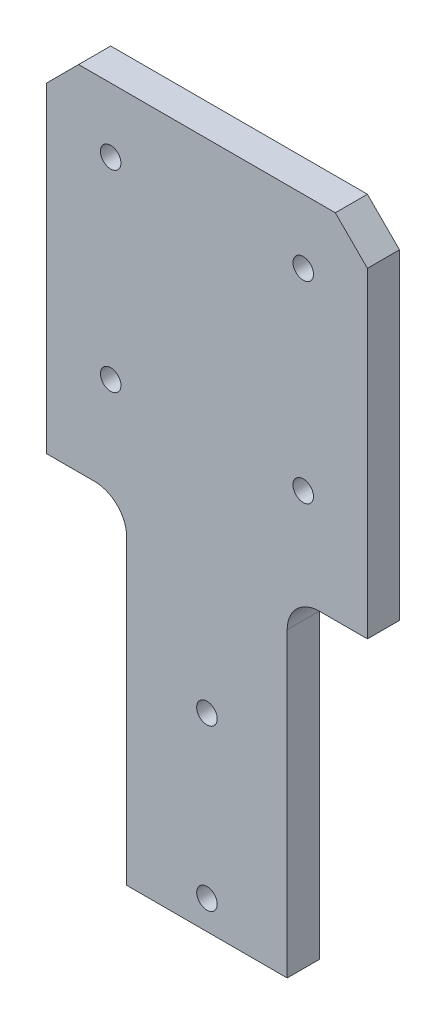
ISO-10303-21;
HEADER;
FILE_DESCRIPTION(('STEP AP214'),'2;1');
FILE_NAME('part.step','',(''),(''),'','','');
FILE_SCHEMA(('AUTOMOTIVE_DESIGN { 1 0 10303 214 1 1 1 1 }'));
ENDSEC;
DATA;
#1=APPLICATION_CONTEXT('core data for automotive mechanical design processes');
#2=APPLICATION_PROTOCOL_DEFINITION('international standard','automotive_design',2000,#1);
#3=PRODUCT_CONTEXT('',#1,'mechanical');
#4=PRODUCT('Part','Part','',(#3));
#5=PRODUCT_RELATED_PRODUCT_CATEGORY('part','',(#4));
#6=PRODUCT_DEFINITION_FORMATION('','',#4);
#7=PRODUCT_DEFINITION_CONTEXT('part definition',#1,'design');
#8=PRODUCT_DEFINITION('design','',#6,#7);
#9=PRODUCT_DEFINITION_SHAPE('','',#8);
#10=(LENGTH_UNIT() NAMED_UNIT(*) SI_UNIT(.MILLI.,.METRE.));
#11=(NAMED_UNIT(*) PLANE_ANGLE_UNIT() SI_UNIT($,.RADIAN.));
#12=(NAMED_UNIT(*) SI_UNIT($,.STERADIAN.) SOLID_ANGLE_UNIT());
#13=UNCERTAINTY_MEASURE_WITH_UNIT(LENGTH_MEASURE(1.E-05),#10,'distance_accuracy_value','');
#14=(GEOMETRIC_REPRESENTATION_CONTEXT(3) GLOBAL_UNCERTAINTY_ASSIGNED_CONTEXT((#13)) GLOBAL_UNIT_ASSIGNED_CONTEXT((#10,
#11,#12)) REPRESENTATION_CONTEXT('',''));
#15=CARTESIAN_POINT('',(0.,0.,0.));
#16=DIRECTION('',(0.,0.,1.));
#17=DIRECTION('',(1.,0.,0.));
#18=AXIS2_PLACEMENT_3D('',#15,#16,#17);
#19=CARTESIAN_POINT('',(0.,0.,5.));
#20=DIRECTION('',(0.,0.,1.));
#21=DIRECTION('',(1.,0.,0.));
#22=AXIS2_PLACEMENT_3D('',#19,#20,#21);
#23=PLANE('',#22);
#24=CARTESIAN_POINT('',(-15.,41.,5.));
#25=DIRECTION('',(0.,0.,1.));
#26=DIRECTION('',(1.,0.,0.));
#27=AXIS2_PLACEMENT_3D('',#24,#25,#26);
#28=CIRCLE('',#27,1.6);
#29=CARTESIAN_POINT('',(-13.4,41.,5.));
#30=VERTEX_POINT('',#29);
#31=EDGE_CURVE('E450',#30,#30,#28,.T.);
#32=ORIENTED_EDGE('',*,*,#31,.F.);
#33=EDGE_LOOP('',(#32));
#34=FACE_BOUND('',#33,.T.);
#35=CARTESIAN_POINT('',(-15.,71.,5.));
#36=DIRECTION('',(0.,0.,1.));
#37=DIRECTION('',(1.,0.,0.));
#38=AXIS2_PLACEMENT_3D('',#35,#36,#37);
#39=CIRCLE('',#38,1.6);
#40=CARTESIAN_POINT('',(-13.4,71.,5.));
#41=VERTEX_POINT('',#40);
#42=EDGE_CURVE('E438',#41,#41,#39,.T.);
#43=ORIENTED_EDGE('',*,*,#42,.F.);
#44=EDGE_LOOP('',(#43));
#45=FACE_BOUND('',#44,.T.);
#46=CARTESIAN_POINT('',(0.,3.5,5.));
#47=DIRECTION('',(0.,0.,1.));
#48=DIRECTION('',(1.,0.,0.));
#49=AXIS2_PLACEMENT_3D('',#46,#47,#48);
#50=CIRCLE('',#49,1.6);
#51=CARTESIAN_POINT('',(1.6,3.5,5.));
#52=VERTEX_POINT('',#51);
#53=EDGE_CURVE('E166',#52,#52,#50,.T.);
#54=ORIENTED_EDGE('',*,*,#53,.F.);
#55=EDGE_LOOP('',(#54));
#56=FACE_BOUND('',#55,.T.);
#57=DIRECTION('',(0.,1.,0.));
#58=VECTOR('',#57,1.);
#59=CARTESIAN_POINT('',(12.5,26.,5.));
#60=LINE('',#59,#58);
#61=CARTESIAN_POINT('',(12.5,-26.,5.));
#62=VERTEX_POINT('',#61);
#63=CARTESIAN_POINT('',(12.5,21.,5.));
#64=VERTEX_POINT('',#63);
#65=EDGE_CURVE('E131',#62,#64,#60,.T.);
#66=ORIENTED_EDGE('',*,*,#65,.T.);
#67=CARTESIAN_POINT('',(17.5,21.,5.));
#68=DIRECTION('',(0.,0.,1.));
#69=DIRECTION('',(1.,0.,0.));
#70=AXIS2_PLACEMENT_3D('',#67,#68,#69);
#71=CIRCLE('',#70,5.);
#72=CARTESIAN_POINT('',(17.5,26.,5.));
#73=VERTEX_POINT('',#72);
#74=EDGE_CURVE('E11',#64,#73,#71,.F.);
#75=ORIENTED_EDGE('',*,*,#74,.T.);
#76=DIRECTION('',(1.,0.,0.));
#77=VECTOR('',#76,1.);
#78=CARTESIAN_POINT('',(12.5,26.,5.));
#79=LINE('',#78,#77);
#80=CARTESIAN_POINT('',(25.,26.,5.));
#81=VERTEX_POINT('',#80);
#82=EDGE_CURVE('E121',#73,#81,#79,.T.);
#83=ORIENTED_EDGE('',*,*,#82,.T.);
#84=DIRECTION('',(0.,1.,0.));
#85=VECTOR('',#84,1.);
#86=CARTESIAN_POINT('',(25.,26.,5.));
#87=LINE('',#86,#85);
#88=CARTESIAN_POINT('',(25.,76.,5.));
#89=VERTEX_POINT('',#88);
#90=EDGE_CURVE('E125',#81,#89,#87,.T.);
#91=ORIENTED_EDGE('',*,*,#90,.T.);
#92=DIRECTION('',(-0.707106781186547,0.707106781186548,0.));
#93=VECTOR('',#92,1.);
#94=CARTESIAN_POINT('',(20.,81.,5.));
#95=LINE('',#94,#93);
#96=CARTESIAN_POINT('',(20.,81.,5.));
#97=VERTEX_POINT('',#96);
#98=EDGE_CURVE('E145',#89,#97,#95,.T.);
#99=ORIENTED_EDGE('',*,*,#98,.T.);
#100=DIRECTION('',(-1.,0.,0.));
#101=VECTOR('',#100,1.);
#102=CARTESIAN_POINT('',(-20.,81.,5.));
#103=LINE('',#102,#101);
#104=CARTESIAN_POINT('',(-20.,81.,5.));
#105=VERTEX_POINT('',#104);
#106=EDGE_CURVE('E147',#97,#105,#103,.T.);
#107=ORIENTED_EDGE('',*,*,#106,.T.);
#108=DIRECTION('',(-0.707106781186547,-0.707106781186548,0.));
#109=VECTOR('',#108,1.);
#110=CARTESIAN_POINT('',(-25.,76.,5.));
#111=LINE('',#110,#109);
#112=CARTESIAN_POINT('',(-25.,76.,5.));
#113=VERTEX_POINT('',#112);
#114=EDGE_CURVE('E152',#105,#113,#111,.T.);
#115=ORIENTED_EDGE('',*,*,#114,.T.);
#116=DIRECTION('',(0.,-1.,0.));
#117=VECTOR('',#116,1.);
#118=CARTESIAN_POINT('',(-25.,26.,5.));
#119=LINE('',#118,#117);
#120=CARTESIAN_POINT('',(-25.,26.,5.));
#121=VERTEX_POINT('',#120);
#122=EDGE_CURVE('E154',#113,#121,#119,.T.);
#123=ORIENTED_EDGE('',*,*,#122,.T.);
#124=DIRECTION('',(1.,0.,0.));
#125=VECTOR('',#124,1.);
#126=CARTESIAN_POINT('',(-25.,26.,5.));
#127=LINE('',#126,#125);
#128=CARTESIAN_POINT('',(-17.5,26.,5.));
#129=VERTEX_POINT('',#128);
#130=EDGE_CURVE('E156',#121,#129,#127,.T.);
#131=ORIENTED_EDGE('',*,*,#130,.T.);
#132=CARTESIAN_POINT('',(-17.5,21.,5.));
#133=DIRECTION('',(0.,0.,1.));
#134=DIRECTION('',(1.,0.,0.));
#135=AXIS2_PLACEMENT_3D('',#132,#133,#134);
#136=CIRCLE('',#135,5.);
#137=CARTESIAN_POINT('',(-12.5,21.,5.));
#138=VERTEX_POINT('',#137);
#139=EDGE_CURVE('E212',#129,#138,#136,.F.);
#140=ORIENTED_EDGE('',*,*,#139,.T.);
#141=DIRECTION('',(0.,-1.,0.));
#142=VECTOR('',#141,1.);
#143=CARTESIAN_POINT('',(-12.5,26.,5.));
#144=LINE('',#143,#142);
#145=CARTESIAN_POINT('',(-12.5,-26.,5.));
#146=VERTEX_POINT('',#145);
#147=EDGE_CURVE('E159',#138,#146,#144,.T.);
#148=ORIENTED_EDGE('',*,*,#147,.T.);
#149=DIRECTION('',(1.,0.,0.));
#150=VECTOR('',#149,1.);
#151=CARTESIAN_POINT('',(-12.5,-26.,5.));
#152=LINE('',#151,#150);
#153=EDGE_CURVE('E161',#146,#62,#152,.T.);
#154=ORIENTED_EDGE('',*,*,#153,.T.);
#155=EDGE_LOOP('',(#66,#75,#83,#91,#99,#107,#115,#123,#131,#140,#148,#154));
#156=FACE_BOUND('',#155,.T.);
#157=CARTESIAN_POINT('',(0.,-21.5,5.));
#158=DIRECTION('',(0.,0.,1.));
#159=DIRECTION('',(1.,0.,0.));
#160=AXIS2_PLACEMENT_3D('',#157,#158,#159);
#161=CIRCLE('',#160,1.6);
#162=CARTESIAN_POINT('',(1.6,-21.5,5.));
#163=VERTEX_POINT('',#162);
#164=EDGE_CURVE('E432',#163,#163,#161,.T.);
#165=ORIENTED_EDGE('',*,*,#164,.F.);
#166=EDGE_LOOP('',(#165));
#167=FACE_BOUND('',#166,.T.);
#168=CARTESIAN_POINT('',(15.,71.,5.));
#169=DIRECTION('',(0.,0.,1.));
#170=DIRECTION('',(1.,0.,0.));
#171=AXIS2_PLACEMENT_3D('',#168,#169,#170);
#172=CIRCLE('',#171,1.6);
#173=CARTESIAN_POINT('',(16.6,71.,5.));
#174=VERTEX_POINT('',#173);
#175=EDGE_CURVE('E444',#174,#174,#172,.T.);
#176=ORIENTED_EDGE('',*,*,#175,.F.);
#177=EDGE_LOOP('',(#176));
#178=FACE_BOUND('',#177,.T.);
#179=CARTESIAN_POINT('',(15.,41.,5.));
#180=DIRECTION('',(0.,0.,1.));
#181=DIRECTION('',(1.,0.,0.));
#182=AXIS2_PLACEMENT_3D('',#179,#180,#181);
#183=CIRCLE('',#182,1.6);
#184=CARTESIAN_POINT('',(16.6,41.,5.));
#185=VERTEX_POINT('',#184);
#186=EDGE_CURVE('E456',#185,#185,#183,.T.);
#187=ORIENTED_EDGE('',*,*,#186,.F.);
#188=EDGE_LOOP('',(#187));
#189=FACE_BOUND('',#188,.T.);
#190=ADVANCED_FACE('F33',(#34,#45,#56,#156,#167,#178,#189),#23,.T.);
#191=CARTESIAN_POINT('',(0.,0.,0.));
#192=DIRECTION('',(0.,0.,1.));
#193=DIRECTION('',(1.,0.,0.));
#194=AXIS2_PLACEMENT_3D('',#191,#192,#193);
#195=PLANE('',#194);
#196=DIRECTION('',(0.,1.,0.));
#197=VECTOR('',#196,1.);
#198=CARTESIAN_POINT('',(12.5,26.,0.));
#199=LINE('',#198,#197);
#200=CARTESIAN_POINT('',(12.5,-26.,0.));
#201=VERTEX_POINT('',#200);
#202=CARTESIAN_POINT('',(12.5,21.,0.));
#203=VERTEX_POINT('',#202);
#204=EDGE_CURVE('E164',#201,#203,#199,.T.);
#205=ORIENTED_EDGE('',*,*,#204,.F.);
#206=DIRECTION('',(1.,0.,0.));
#207=VECTOR('',#206,1.);
#208=CARTESIAN_POINT('',(-12.5,-26.,0.));
#209=LINE('',#208,#207);
#210=CARTESIAN_POINT('',(-12.5,-26.,0.));
#211=VERTEX_POINT('',#210);
#212=EDGE_CURVE('E183',#211,#201,#209,.T.);
#213=ORIENTED_EDGE('',*,*,#212,.F.);
#214=DIRECTION('',(0.,-1.,0.));
#215=VECTOR('',#214,1.);
#216=CARTESIAN_POINT('',(-12.5,26.,0.));
#217=LINE('',#216,#215);
#218=CARTESIAN_POINT('',(-12.5,21.,0.));
#219=VERTEX_POINT('',#218);
#220=EDGE_CURVE('E181',#219,#211,#217,.T.);
#221=ORIENTED_EDGE('',*,*,#220,.F.);
#222=CARTESIAN_POINT('',(-17.5,21.,0.));
#223=DIRECTION('',(0.,0.,1.));
#224=DIRECTION('',(1.,0.,0.));
#225=AXIS2_PLACEMENT_3D('',#222,#223,#224);
#226=CIRCLE('',#225,5.);
#227=CARTESIAN_POINT('',(-17.5,26.,0.));
#228=VERTEX_POINT('',#227);
#229=EDGE_CURVE('E210',#219,#228,#226,.T.);
#230=ORIENTED_EDGE('',*,*,#229,.T.);
#231=DIRECTION('',(1.,0.,0.));
#232=VECTOR('',#231,1.);
#233=CARTESIAN_POINT('',(-25.,26.,0.));
#234=LINE('',#233,#232);
#235=CARTESIAN_POINT('',(-25.,26.,0.));
#236=VERTEX_POINT('',#235);
#237=EDGE_CURVE('E178',#236,#228,#234,.T.);
#238=ORIENTED_EDGE('',*,*,#237,.F.);
#239=DIRECTION('',(0.,-1.,0.));
#240=VECTOR('',#239,1.);
#241=CARTESIAN_POINT('',(-25.,26.,0.));
#242=LINE('',#241,#240);
#243=CARTESIAN_POINT('',(-25.,76.,0.));
#244=VERTEX_POINT('',#243);
#245=EDGE_CURVE('E176',#244,#236,#242,.T.);
#246=ORIENTED_EDGE('',*,*,#245,.F.);
#247=DIRECTION('',(-0.707106781186547,-0.707106781186548,0.));
#248=VECTOR('',#247,1.);
#249=CARTESIAN_POINT('',(-25.,76.,0.));
#250=LINE('',#249,#248);
#251=CARTESIAN_POINT('',(-20.,81.,0.));
#252=VERTEX_POINT('',#251);
#253=EDGE_CURVE('E174',#252,#244,#250,.T.);
#254=ORIENTED_EDGE('',*,*,#253,.F.);
#255=DIRECTION('',(-1.,0.,0.));
#256=VECTOR('',#255,1.);
#257=CARTESIAN_POINT('',(-20.,81.,0.));
#258=LINE('',#257,#256);
#259=CARTESIAN_POINT('',(20.,81.,0.));
#260=VERTEX_POINT('',#259);
#261=EDGE_CURVE('E172',#260,#252,#258,.T.);
#262=ORIENTED_EDGE('',*,*,#261,.F.);
#263=DIRECTION('',(-0.707106781186547,0.707106781186548,0.));
#264=VECTOR('',#263,1.);
#265=CARTESIAN_POINT('',(20.,81.,0.));
#266=LINE('',#265,#264);
#267=CARTESIAN_POINT('',(25.,76.,0.));
#268=VERTEX_POINT('',#267);
#269=EDGE_CURVE('E170',#268,#260,#266,.T.);
#270=ORIENTED_EDGE('',*,*,#269,.F.);
#271=DIRECTION('',(0.,1.,0.));
#272=VECTOR('',#271,1.);
#273=CARTESIAN_POINT('',(25.,26.,0.));
#274=LINE('',#273,#272);
#275=CARTESIAN_POINT('',(25.,26.,0.));
#276=VERTEX_POINT('',#275);
#277=EDGE_CURVE('E168',#276,#268,#274,.T.);
#278=ORIENTED_EDGE('',*,*,#277,.F.);
#279=DIRECTION('',(1.,0.,0.));
#280=VECTOR('',#279,1.);
#281=CARTESIAN_POINT('',(12.5,26.,0.));
#282=LINE('',#281,#280);
#283=CARTESIAN_POINT('',(17.5,26.,0.));
#284=VERTEX_POINT('',#283);
#285=EDGE_CURVE('E136',#284,#276,#282,.T.);
#286=ORIENTED_EDGE('',*,*,#285,.F.);
#287=CARTESIAN_POINT('',(17.5,21.,0.));
#288=DIRECTION('',(0.,0.,1.));
#289=DIRECTION('',(1.,0.,0.));
#290=AXIS2_PLACEMENT_3D('',#287,#288,#289);
#291=CIRCLE('',#290,5.);
#292=EDGE_CURVE('E41',#284,#203,#291,.T.);
#293=ORIENTED_EDGE('',*,*,#292,.T.);
#294=EDGE_LOOP('',(#205,#213,#221,#230,#238,#246,#254,#262,#270,#278,#286,#293));
#295=FACE_BOUND('',#294,.T.);
#296=CARTESIAN_POINT('',(0.,3.5,0.));
#297=DIRECTION('',(0.,0.,1.));
#298=DIRECTION('',(1.,0.,0.));
#299=AXIS2_PLACEMENT_3D('',#296,#297,#298);
#300=CIRCLE('',#299,1.6);
#301=CARTESIAN_POINT('',(1.6,3.5,0.));
#302=VERTEX_POINT('',#301);
#303=EDGE_CURVE('E429',#302,#302,#300,.T.);
#304=ORIENTED_EDGE('',*,*,#303,.T.);
#305=EDGE_LOOP('',(#304));
#306=FACE_BOUND('',#305,.T.);
#307=CARTESIAN_POINT('',(0.,-21.5,0.));
#308=DIRECTION('',(0.,0.,1.));
#309=DIRECTION('',(1.,0.,0.));
#310=AXIS2_PLACEMENT_3D('',#307,#308,#309);
#311=CIRCLE('',#310,1.6);
#312=CARTESIAN_POINT('',(1.6,-21.5,0.));
#313=VERTEX_POINT('',#312);
#314=EDGE_CURVE('E435',#313,#313,#311,.T.);
#315=ORIENTED_EDGE('',*,*,#314,.T.);
#316=EDGE_LOOP('',(#315));
#317=FACE_BOUND('',#316,.T.);
#318=CARTESIAN_POINT('',(-15.,71.,0.));
#319=DIRECTION('',(0.,0.,1.));
#320=DIRECTION('',(1.,0.,0.));
#321=AXIS2_PLACEMENT_3D('',#318,#319,#320);
#322=CIRCLE('',#321,1.6);
#323=CARTESIAN_POINT('',(-13.4,71.,0.));
#324=VERTEX_POINT('',#323);
#325=EDGE_CURVE('E441',#324,#324,#322,.T.);
#326=ORIENTED_EDGE('',*,*,#325,.T.);
#327=EDGE_LOOP('',(#326));
#328=FACE_BOUND('',#327,.T.);
#329=CARTESIAN_POINT('',(15.,71.,0.));
#330=DIRECTION('',(0.,0.,1.));
#331=DIRECTION('',(1.,0.,0.));
#332=AXIS2_PLACEMENT_3D('',#329,#330,#331);
#333=CIRCLE('',#332,1.6);
#334=CARTESIAN_POINT('',(16.6,71.,0.));
#335=VERTEX_POINT('',#334);
#336=EDGE_CURVE('E447',#335,#335,#333,.T.);
#337=ORIENTED_EDGE('',*,*,#336,.T.);
#338=EDGE_LOOP('',(#337));
#339=FACE_BOUND('',#338,.T.);
#340=CARTESIAN_POINT('',(-15.,41.,0.));
#341=DIRECTION('',(0.,0.,1.));
#342=DIRECTION('',(1.,0.,0.));
#343=AXIS2_PLACEMENT_3D('',#340,#341,#342);
#344=CIRCLE('',#343,1.6);
#345=CARTESIAN_POINT('',(-13.4,41.,0.));
#346=VERTEX_POINT('',#345);
#347=EDGE_CURVE('E453',#346,#346,#344,.T.);
#348=ORIENTED_EDGE('',*,*,#347,.T.);
#349=EDGE_LOOP('',(#348));
#350=FACE_BOUND('',#349,.T.);
#351=CARTESIAN_POINT('',(15.,41.,0.));
#352=DIRECTION('',(0.,0.,1.));
#353=DIRECTION('',(1.,0.,0.));
#354=AXIS2_PLACEMENT_3D('',#351,#352,#353);
#355=CIRCLE('',#354,1.6);
#356=CARTESIAN_POINT('',(16.6,41.,0.));
#357=VERTEX_POINT('',#356);
#358=EDGE_CURVE('E459',#357,#357,#355,.T.);
#359=ORIENTED_EDGE('',*,*,#358,.T.);
#360=EDGE_LOOP('',(#359));
#361=FACE_BOUND('',#360,.T.);
#362=ADVANCED_FACE('F226',(#295,#306,#317,#328,#339,#350,#361),#195,.F.);
#363=CARTESIAN_POINT('',(12.5,26.,5.));
#364=DIRECTION('',(-1.,0.,0.));
#365=DIRECTION('',(0.,-1.,0.));
#366=AXIS2_PLACEMENT_3D('',#363,#364,#365);
#367=PLANE('',#366);
#368=ORIENTED_EDGE('',*,*,#204,.T.);
#369=DIRECTION('',(0.,0.,-1.));
#370=VECTOR('',#369,1.);
#371=CARTESIAN_POINT('',(12.5,21.,5.));
#372=LINE('',#371,#370);
#373=EDGE_CURVE('E48',#203,#64,#372,.F.);
#374=ORIENTED_EDGE('',*,*,#373,.T.);
#375=ORIENTED_EDGE('',*,*,#65,.F.);
#376=DIRECTION('',(0.,0.,-1.));
#377=VECTOR('',#376,1.);
#378=CARTESIAN_POINT('',(12.5,-26.,5.));
#379=LINE('',#378,#377);
#380=EDGE_CURVE('E163',#62,#201,#379,.T.);
#381=ORIENTED_EDGE('',*,*,#380,.T.);
#382=EDGE_LOOP('',(#368,#374,#375,#381));
#383=FACE_BOUND('',#382,.T.);
#384=ADVANCED_FACE('F264',(#383),#367,.F.);
#385=CARTESIAN_POINT('',(12.5,26.,5.));
#386=DIRECTION('',(0.,1.,0.));
#387=DIRECTION('',(0.,0.,1.));
#388=AXIS2_PLACEMENT_3D('',#385,#386,#387);
#389=PLANE('',#388);
#390=ORIENTED_EDGE('',*,*,#82,.F.);
#391=DIRECTION('',(0.,0.,-1.));
#392=VECTOR('',#391,1.);
#393=CARTESIAN_POINT('',(17.5,26.,0.));
#394=LINE('',#393,#392);
#395=EDGE_CURVE('E207',#73,#284,#394,.T.);
#396=ORIENTED_EDGE('',*,*,#395,.T.);
#397=ORIENTED_EDGE('',*,*,#285,.T.);
#398=DIRECTION('',(0.,0.,-1.));
#399=VECTOR('',#398,1.);
#400=CARTESIAN_POINT('',(25.,26.,5.));
#401=LINE('',#400,#399);
#402=EDGE_CURVE('E134',#81,#276,#401,.T.);
#403=ORIENTED_EDGE('',*,*,#402,.F.);
#404=EDGE_LOOP('',(#390,#396,#397,#403));
#405=FACE_BOUND('',#404,.T.);
#406=ADVANCED_FACE('F135',(#405),#389,.F.);
#407=CARTESIAN_POINT('',(25.,26.,5.));
#408=DIRECTION('',(-1.,0.,0.));
#409=DIRECTION('',(0.,-1.,0.));
#410=AXIS2_PLACEMENT_3D('',#407,#408,#409);
#411=PLANE('',#410);
#412=ORIENTED_EDGE('',*,*,#277,.T.);
#413=DIRECTION('',(0.,0.,-1.));
#414=VECTOR('',#413,1.);
#415=CARTESIAN_POINT('',(25.,76.,5.));
#416=LINE('',#415,#414);
#417=EDGE_CURVE('E140',#89,#268,#416,.T.);
#418=ORIENTED_EDGE('',*,*,#417,.F.);
#419=ORIENTED_EDGE('',*,*,#90,.F.);
#420=ORIENTED_EDGE('',*,*,#402,.T.);
#421=EDGE_LOOP('',(#412,#418,#419,#420));
#422=FACE_BOUND('',#421,.T.);
#423=ADVANCED_FACE('F142',(#422),#411,.F.);
#424=CARTESIAN_POINT('',(20.,81.,5.));
#425=DIRECTION('',(-0.707106781186548,-0.707106781186547,0.));
#426=DIRECTION('',(0.707106781186547,-0.707106781186548,0.));
#427=AXIS2_PLACEMENT_3D('',#424,#425,#426);
#428=PLANE('',#427);
#429=ORIENTED_EDGE('',*,*,#269,.T.);
#430=DIRECTION('',(0.,0.,-1.));
#431=VECTOR('',#430,1.);
#432=CARTESIAN_POINT('',(20.,81.,5.));
#433=LINE('',#432,#431);
#434=EDGE_CURVE('E199',#97,#260,#433,.T.);
#435=ORIENTED_EDGE('',*,*,#434,.F.);
#436=ORIENTED_EDGE('',*,*,#98,.F.);
#437=ORIENTED_EDGE('',*,*,#417,.T.);
#438=EDGE_LOOP('',(#429,#435,#436,#437));
#439=FACE_BOUND('',#438,.T.);
#440=ADVANCED_FACE('F249',(#439),#428,.F.);
#441=CARTESIAN_POINT('',(-20.,81.,5.));
#442=DIRECTION('',(0.,-1.,0.));
#443=DIRECTION('',(0.,0.,-1.));
#444=AXIS2_PLACEMENT_3D('',#441,#442,#443);
#445=PLANE('',#444);
#446=ORIENTED_EDGE('',*,*,#261,.T.);
#447=DIRECTION('',(0.,0.,-1.));
#448=VECTOR('',#447,1.);
#449=CARTESIAN_POINT('',(-20.,81.,5.));
#450=LINE('',#449,#448);
#451=EDGE_CURVE('E196',#105,#252,#450,.T.);
#452=ORIENTED_EDGE('',*,*,#451,.F.);
#453=ORIENTED_EDGE('',*,*,#106,.F.);
#454=ORIENTED_EDGE('',*,*,#434,.T.);
#455=EDGE_LOOP('',(#446,#452,#453,#454));
#456=FACE_BOUND('',#455,.T.);
#457=ADVANCED_FACE('F246',(#456),#445,.F.);
#458=CARTESIAN_POINT('',(-25.,76.,5.));
#459=DIRECTION('',(0.707106781186548,-0.707106781186547,0.));
#460=DIRECTION('',(0.707106781186547,0.707106781186548,0.));
#461=AXIS2_PLACEMENT_3D('',#458,#459,#460);
#462=PLANE('',#461);
#463=ORIENTED_EDGE('',*,*,#253,.T.);
#464=DIRECTION('',(0.,0.,-1.));
#465=VECTOR('',#464,1.);
#466=CARTESIAN_POINT('',(-25.,76.,5.));
#467=LINE('',#466,#465);
#468=EDGE_CURVE('E193',#113,#244,#467,.T.);
#469=ORIENTED_EDGE('',*,*,#468,.F.);
#470=ORIENTED_EDGE('',*,*,#114,.F.);
#471=ORIENTED_EDGE('',*,*,#451,.T.);
#472=EDGE_LOOP('',(#463,#469,#470,#471));
#473=FACE_BOUND('',#472,.T.);
#474=ADVANCED_FACE('F241',(#473),#462,.F.);
#475=CARTESIAN_POINT('',(-25.,26.,5.));
#476=DIRECTION('',(1.,0.,0.));
#477=DIRECTION('',(0.,1.,0.));
#478=AXIS2_PLACEMENT_3D('',#475,#476,#477);
#479=PLANE('',#478);
#480=ORIENTED_EDGE('',*,*,#245,.T.);
#481=DIRECTION('',(0.,0.,-1.));
#482=VECTOR('',#481,1.);
#483=CARTESIAN_POINT('',(-25.,26.,5.));
#484=LINE('',#483,#482);
#485=EDGE_CURVE('E190',#121,#236,#484,.T.);
#486=ORIENTED_EDGE('',*,*,#485,.F.);
#487=ORIENTED_EDGE('',*,*,#122,.F.);
#488=ORIENTED_EDGE('',*,*,#468,.T.);
#489=EDGE_LOOP('',(#480,#486,#487,#488));
#490=FACE_BOUND('',#489,.T.);
#491=ADVANCED_FACE('F235',(#490),#479,.F.);
#492=CARTESIAN_POINT('',(-25.,26.,5.));
#493=DIRECTION('',(0.,1.,0.));
#494=DIRECTION('',(-1.,0.,0.));
#495=AXIS2_PLACEMENT_3D('',#492,#493,#494);
#496=PLANE('',#495);
#497=ORIENTED_EDGE('',*,*,#237,.T.);
#498=DIRECTION('',(0.,0.,-1.));
#499=VECTOR('',#498,1.);
#500=CARTESIAN_POINT('',(-17.5,26.,5.));
#501=LINE('',#500,#499);
#502=EDGE_CURVE('E205',#228,#129,#501,.F.);
#503=ORIENTED_EDGE('',*,*,#502,.T.);
#504=ORIENTED_EDGE('',*,*,#130,.F.);
#505=ORIENTED_EDGE('',*,*,#485,.T.);
#506=EDGE_LOOP('',(#497,#503,#504,#505));
#507=FACE_BOUND('',#506,.T.);
#508=ADVANCED_FACE('F231',(#507),#496,.F.);
#509=CARTESIAN_POINT('',(-12.5,26.,5.));
#510=DIRECTION('',(1.,0.,0.));
#511=DIRECTION('',(0.,1.,0.));
#512=AXIS2_PLACEMENT_3D('',#509,#510,#511);
#513=PLANE('',#512);
#514=ORIENTED_EDGE('',*,*,#147,.F.);
#515=DIRECTION('',(0.,0.,-1.));
#516=VECTOR('',#515,1.);
#517=CARTESIAN_POINT('',(-12.5,21.,0.));
#518=LINE('',#517,#516);
#519=EDGE_CURVE('E139',#138,#219,#518,.T.);
#520=ORIENTED_EDGE('',*,*,#519,.T.);
#521=ORIENTED_EDGE('',*,*,#220,.T.);
#522=DIRECTION('',(0.,0.,-1.));
#523=VECTOR('',#522,1.);
#524=CARTESIAN_POINT('',(-12.5,-26.,5.));
#525=LINE('',#524,#523);
#526=EDGE_CURVE('E187',#146,#211,#525,.T.);
#527=ORIENTED_EDGE('',*,*,#526,.F.);
#528=EDGE_LOOP('',(#514,#520,#521,#527));
#529=FACE_BOUND('',#528,.T.);
#530=ADVANCED_FACE('F221',(#529),#513,.F.);
#531=CARTESIAN_POINT('',(-12.5,-26.,5.));
#532=DIRECTION('',(0.,1.,0.));
#533=DIRECTION('',(0.,0.,1.));
#534=AXIS2_PLACEMENT_3D('',#531,#532,#533);
#535=PLANE('',#534);
#536=ORIENTED_EDGE('',*,*,#212,.T.);
#537=ORIENTED_EDGE('',*,*,#380,.F.);
#538=ORIENTED_EDGE('',*,*,#153,.F.);
#539=ORIENTED_EDGE('',*,*,#526,.T.);
#540=EDGE_LOOP('',(#536,#537,#538,#539));
#541=FACE_BOUND('',#540,.T.);
#542=ADVANCED_FACE('F272',(#541),#535,.F.);
#543=CARTESIAN_POINT('',(0.,3.5,5.));
#544=DIRECTION('',(0.,0.,-1.));
#545=DIRECTION('',(-1.,0.,0.));
#546=AXIS2_PLACEMENT_3D('',#543,#544,#545);
#547=CYLINDRICAL_SURFACE('',#546,1.6);
#548=ORIENTED_EDGE('',*,*,#53,.T.);
#549=EDGE_LOOP('',(#548));
#550=FACE_BOUND('',#549,.T.);
#551=ORIENTED_EDGE('',*,*,#303,.F.);
#552=EDGE_LOOP('',(#551));
#553=FACE_BOUND('',#552,.T.);
#554=ADVANCED_FACE('F269',(#550,#553),#547,.F.);
#555=CARTESIAN_POINT('',(0.,-21.5,5.));
#556=DIRECTION('',(0.,0.,-1.));
#557=DIRECTION('',(-1.,0.,0.));
#558=AXIS2_PLACEMENT_3D('',#555,#556,#557);
#559=CYLINDRICAL_SURFACE('',#558,1.6);
#560=ORIENTED_EDGE('',*,*,#164,.T.);
#561=EDGE_LOOP('',(#560));
#562=FACE_BOUND('',#561,.T.);
#563=ORIENTED_EDGE('',*,*,#314,.F.);
#564=EDGE_LOOP('',(#563));
#565=FACE_BOUND('',#564,.T.);
#566=ADVANCED_FACE('F311',(#562,#565),#559,.F.);
#567=CARTESIAN_POINT('',(-15.,71.,5.));
#568=DIRECTION('',(0.,0.,-1.));
#569=DIRECTION('',(-1.,0.,0.));
#570=AXIS2_PLACEMENT_3D('',#567,#568,#569);
#571=CYLINDRICAL_SURFACE('',#570,1.6);
#572=ORIENTED_EDGE('',*,*,#42,.T.);
#573=EDGE_LOOP('',(#572));
#574=FACE_BOUND('',#573,.T.);
#575=ORIENTED_EDGE('',*,*,#325,.F.);
#576=EDGE_LOOP('',(#575));
#577=FACE_BOUND('',#576,.T.);
#578=ADVANCED_FACE('F318',(#574,#577),#571,.F.);
#579=CARTESIAN_POINT('',(15.,71.,5.));
#580=DIRECTION('',(0.,0.,-1.));
#581=DIRECTION('',(-1.,0.,0.));
#582=AXIS2_PLACEMENT_3D('',#579,#580,#581);
#583=CYLINDRICAL_SURFACE('',#582,1.6);
#584=ORIENTED_EDGE('',*,*,#175,.T.);
#585=EDGE_LOOP('',(#584));
#586=FACE_BOUND('',#585,.T.);
#587=ORIENTED_EDGE('',*,*,#336,.F.);
#588=EDGE_LOOP('',(#587));
#589=FACE_BOUND('',#588,.T.);
#590=ADVANCED_FACE('F325',(#586,#589),#583,.F.);
#591=CARTESIAN_POINT('',(-15.,41.,5.));
#592=DIRECTION('',(0.,0.,-1.));
#593=DIRECTION('',(-1.,0.,0.));
#594=AXIS2_PLACEMENT_3D('',#591,#592,#593);
#595=CYLINDRICAL_SURFACE('',#594,1.6);
#596=ORIENTED_EDGE('',*,*,#31,.T.);
#597=EDGE_LOOP('',(#596));
#598=FACE_BOUND('',#597,.T.);
#599=ORIENTED_EDGE('',*,*,#347,.F.);
#600=EDGE_LOOP('',(#599));
#601=FACE_BOUND('',#600,.T.);
#602=ADVANCED_FACE('F333',(#598,#601),#595,.F.);
#603=CARTESIAN_POINT('',(15.,41.,5.));
#604=DIRECTION('',(0.,0.,-1.));
#605=DIRECTION('',(-1.,0.,0.));
#606=AXIS2_PLACEMENT_3D('',#603,#604,#605);
#607=CYLINDRICAL_SURFACE('',#606,1.6);
#608=ORIENTED_EDGE('',*,*,#186,.T.);
#609=EDGE_LOOP('',(#608));
#610=FACE_BOUND('',#609,.T.);
#611=ORIENTED_EDGE('',*,*,#358,.F.);
#612=EDGE_LOOP('',(#611));
#613=FACE_BOUND('',#612,.T.);
#614=ADVANCED_FACE('F341',(#610,#613),#607,.F.);
#615=CARTESIAN_POINT('',(-17.5,21.,5.));
#616=DIRECTION('',(0.,0.,1.));
#617=DIRECTION('',(1.,0.,0.));
#618=AXIS2_PLACEMENT_3D('',#615,#616,#617);
#619=CYLINDRICAL_SURFACE('',#618,5.);
#620=ORIENTED_EDGE('',*,*,#139,.F.);
#621=ORIENTED_EDGE('',*,*,#502,.F.);
#622=ORIENTED_EDGE('',*,*,#229,.F.);
#623=ORIENTED_EDGE('',*,*,#519,.F.);
#624=EDGE_LOOP('',(#620,#621,#622,#623));
#625=FACE_BOUND('',#624,.T.);
#626=ADVANCED_FACE('F224',(#625),#619,.F.);
#627=CARTESIAN_POINT('',(17.5,21.,5.));
#628=DIRECTION('',(0.,0.,1.));
#629=DIRECTION('',(1.,0.,0.));
#630=AXIS2_PLACEMENT_3D('',#627,#628,#629);
#631=CYLINDRICAL_SURFACE('',#630,5.);
#632=ORIENTED_EDGE('',*,*,#74,.F.);
#633=ORIENTED_EDGE('',*,*,#373,.F.);
#634=ORIENTED_EDGE('',*,*,#292,.F.);
#635=ORIENTED_EDGE('',*,*,#395,.F.);
#636=EDGE_LOOP('',(#632,#633,#634,#635));
#637=FACE_BOUND('',#636,.T.);
#638=ADVANCED_FACE('F35',(#637),#631,.F.);
#639=CLOSED_SHELL('',(#190,#362,#384,#406,#423,#440,#457,#474,#491,#508,#530,#542,#554,#566,
#578,#590,#602,#614,#626,#638));
#640=MANIFOLD_SOLID_BREP('B2',#639);
#641=ADVANCED_BREP_SHAPE_REPRESENTATION('',(#18,#640),#14);
#642=SHAPE_DEFINITION_REPRESENTATION(#9,#641);
ENDSEC;
END-ISO-10303-21;
